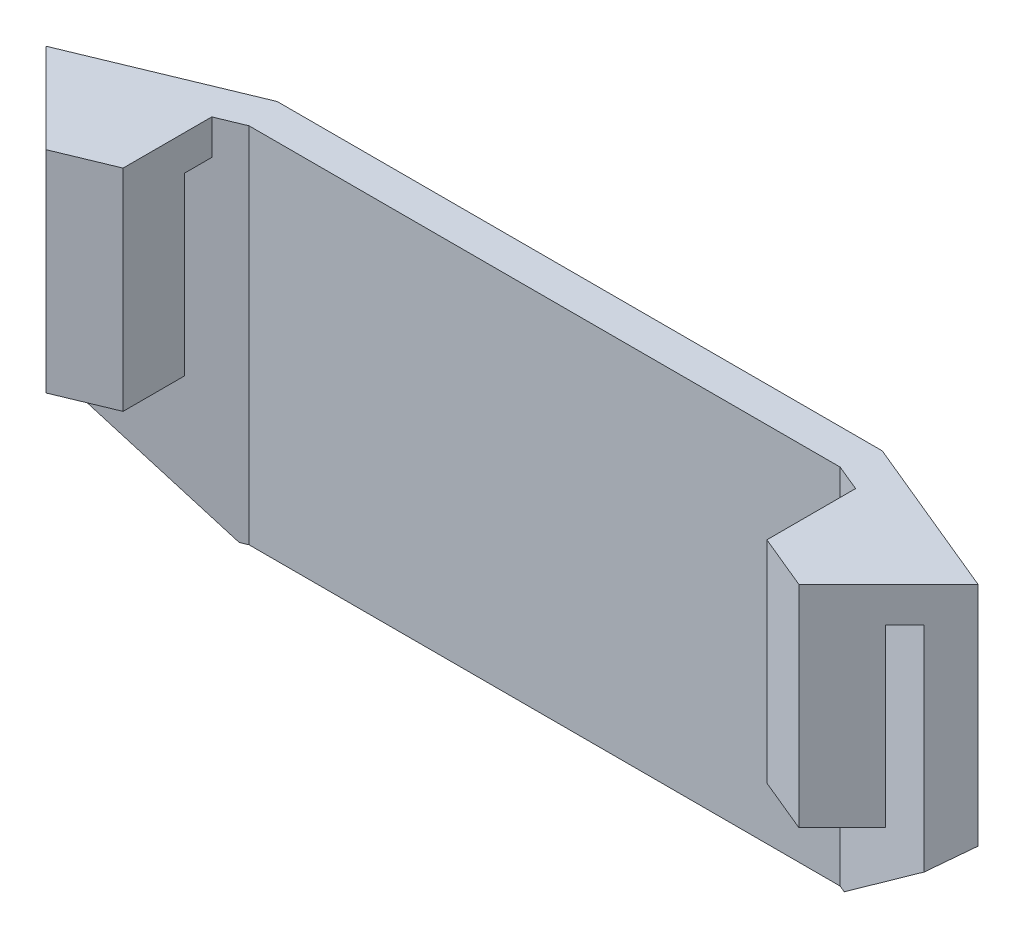
ISO-10303-21;
HEADER;
FILE_DESCRIPTION(('STEP AP214'),'2;1');
FILE_NAME('part.step','',(''),(''),'','','');
FILE_SCHEMA(('AUTOMOTIVE_DESIGN { 1 0 10303 214 1 1 1 1 }'));
ENDSEC;
DATA;
#1=APPLICATION_CONTEXT('core data for automotive mechanical design processes');
#2=APPLICATION_PROTOCOL_DEFINITION('international standard','automotive_design',2000,#1);
#3=PRODUCT_CONTEXT('',#1,'mechanical');
#4=PRODUCT('Part','Part','',(#3));
#5=PRODUCT_RELATED_PRODUCT_CATEGORY('part','',(#4));
#6=PRODUCT_DEFINITION_FORMATION('','',#4);
#7=PRODUCT_DEFINITION_CONTEXT('part definition',#1,'design');
#8=PRODUCT_DEFINITION('design','',#6,#7);
#9=PRODUCT_DEFINITION_SHAPE('','',#8);
#10=(LENGTH_UNIT() NAMED_UNIT(*) SI_UNIT(.MILLI.,.METRE.));
#11=(NAMED_UNIT(*) PLANE_ANGLE_UNIT() SI_UNIT($,.RADIAN.));
#12=(NAMED_UNIT(*) SI_UNIT($,.STERADIAN.) SOLID_ANGLE_UNIT());
#13=UNCERTAINTY_MEASURE_WITH_UNIT(LENGTH_MEASURE(1.E-05),#10,'distance_accuracy_value','');
#14=(GEOMETRIC_REPRESENTATION_CONTEXT(3) GLOBAL_UNCERTAINTY_ASSIGNED_CONTEXT((#13)) GLOBAL_UNIT_ASSIGNED_CONTEXT((#10,
#11,#12)) REPRESENTATION_CONTEXT('',''));
#15=CARTESIAN_POINT('',(0.,0.,0.));
#16=DIRECTION('',(0.,0.,1.));
#17=DIRECTION('',(1.,0.,0.));
#18=AXIS2_PLACEMENT_3D('',#15,#16,#17);
#19=CARTESIAN_POINT('',(0.,0.,0.));
#20=DIRECTION('',(0.,-1.,0.));
#21=DIRECTION('',(0.,0.,-1.));
#22=AXIS2_PLACEMENT_3D('',#19,#20,#21);
#23=PLANE('',#22);
#24=DIRECTION('',(0.707106781186538,0.,-0.707106781186557));
#25=VECTOR('',#24,1.);
#26=CARTESIAN_POINT('',(21.2965728752552,0.,21.2965728752546));
#27=LINE('',#26,#25);
#28=CARTESIAN_POINT('',(35.8679172081224,0.,6.72522854238762));
#29=VERTEX_POINT('',#28);
#30=CARTESIAN_POINT('',(37.5134559672924,0.,5.07968978321691));
#31=VERTEX_POINT('',#30);
#32=EDGE_CURVE('E200',#29,#31,#27,.T.);
#33=ORIENTED_EDGE('',*,*,#32,.F.);
#34=DIRECTION('',(0.923879532511287,0.,0.38268343236509));
#35=VECTOR('',#34,1.);
#36=CARTESIAN_POINT('',(27.4999999999994,0.,3.25912374596785));
#37=LINE('',#36,#35);
#38=CARTESIAN_POINT('',(27.4999999999994,0.,3.25912374596785));
#39=VERTEX_POINT('',#38);
#40=EDGE_CURVE('E184',#39,#29,#37,.T.);
#41=ORIENTED_EDGE('',*,*,#40,.F.);
#42=DIRECTION('',(0.,0.,1.));
#43=VECTOR('',#42,1.);
#44=CARTESIAN_POINT('',(27.5000000000006,0.,0.));
#45=LINE('',#44,#43);
#46=CARTESIAN_POINT('',(27.5000000000006,0.,0.931980515339538));
#47=VERTEX_POINT('',#46);
#48=EDGE_CURVE('E341',#47,#39,#45,.T.);
#49=ORIENTED_EDGE('',*,*,#48,.F.);
#50=DIRECTION('',(-0.923879532511312,0.,-0.382683432365028));
#51=VECTOR('',#50,1.);
#52=CARTESIAN_POINT('',(25.25,0.,0.));
#53=LINE('',#52,#51);
#54=EDGE_CURVE('E209',#31,#47,#53,.T.);
#55=ORIENTED_EDGE('',*,*,#54,.F.);
#56=EDGE_LOOP('',(#33,#41,#49,#55));
#57=FACE_BOUND('',#56,.T.);
#58=ADVANCED_FACE('F49',(#57),#23,.T.);
#59=DIRECTION('',(0.,0.,-1.));
#60=VECTOR('',#59,1.);
#61=CARTESIAN_POINT('',(-27.4999999999994,0.,0.));
#62=LINE('',#61,#60);
#63=CARTESIAN_POINT('',(-27.4999999999994,0.,3.25912374596785));
#64=VERTEX_POINT('',#63);
#65=CARTESIAN_POINT('',(-27.4999999999994,0.,0.9319805153392));
#66=VERTEX_POINT('',#65);
#67=EDGE_CURVE('E328',#64,#66,#62,.T.);
#68=ORIENTED_EDGE('',*,*,#67,.F.);
#69=DIRECTION('',(0.923879532511287,0.,-0.38268343236509));
#70=VECTOR('',#69,1.);
#71=CARTESIAN_POINT('',(-27.4999999999994,0.,3.25912374596785));
#72=LINE('',#71,#70);
#73=CARTESIAN_POINT('',(-35.8679172081224,0.,6.72522854238762));
#74=VERTEX_POINT('',#73);
#75=EDGE_CURVE('E194',#74,#64,#72,.T.);
#76=ORIENTED_EDGE('',*,*,#75,.F.);
#77=DIRECTION('',(0.707106781186536,0.,0.707106781186559));
#78=VECTOR('',#77,1.);
#79=CARTESIAN_POINT('',(-21.2965728752556,0.,21.2965728752549));
#80=LINE('',#79,#78);
#81=CARTESIAN_POINT('',(-37.5134559672923,0.,5.07968978321773));
#82=VERTEX_POINT('',#81);
#83=EDGE_CURVE('E217',#82,#74,#80,.T.);
#84=ORIENTED_EDGE('',*,*,#83,.F.);
#85=DIRECTION('',(-0.92387953251129,0.,0.382683432365082));
#86=VECTOR('',#85,1.);
#87=CARTESIAN_POINT('',(-41.5134559672924,0.,6.73654403270998));
#88=LINE('',#87,#86);
#89=EDGE_CURVE('E257',#66,#82,#88,.T.);
#90=ORIENTED_EDGE('',*,*,#89,.F.);
#91=EDGE_LOOP('',(#68,#76,#84,#90));
#92=FACE_BOUND('',#91,.T.);
#93=ADVANCED_FACE('F435',(#92),#23,.T.);
#94=CARTESIAN_POINT('',(-27.25,3.,8.40517252679576));
#95=DIRECTION('',(-0.382683432365091,0.,-0.923879532511287));
#96=DIRECTION('',(-0.923879532511287,0.,0.382683432365091));
#97=AXIS2_PLACEMENT_3D('',#94,#95,#96);
#98=PLANE('',#97);
#99=DIRECTION('',(0.,1.,0.));
#100=VECTOR('',#99,1.);
#101=CARTESIAN_POINT('',(-32.1558879141792,-41.2003756189153,10.437257836331));
#102=LINE('',#101,#100);
#103=CARTESIAN_POINT('',(-32.1558879141792,-15.,10.437257836331));
#104=VERTEX_POINT('',#103);
#105=CARTESIAN_POINT('',(-32.1558879141792,3.,10.437257836331));
#106=VERTEX_POINT('',#105);
#107=EDGE_CURVE('E331',#104,#106,#102,.T.);
#108=ORIENTED_EDGE('',*,*,#107,.F.);
#109=DIRECTION('',(-0.923879532511287,0.,0.38268343236509));
#110=VECTOR('',#109,1.);
#111=CARTESIAN_POINT('',(-32.1558879141792,-15.,10.437257836331));
#112=LINE('',#111,#110);
#113=CARTESIAN_POINT('',(-27.4999999999994,-15.,8.50872591738877));
#114=VERTEX_POINT('',#113);
#115=EDGE_CURVE('E368',#114,#104,#112,.T.);
#116=ORIENTED_EDGE('',*,*,#115,.F.);
#117=DIRECTION('',(0.,1.,0.));
#118=VECTOR('',#117,1.);
#119=CARTESIAN_POINT('',(-27.4999999999994,-83.6542758172024,8.50872591738877));
#120=LINE('',#119,#118);
#121=CARTESIAN_POINT('',(-27.4999999999994,3.,8.50872591738877));
#122=VERTEX_POINT('',#121);
#123=EDGE_CURVE('E348',#114,#122,#120,.T.);
#124=ORIENTED_EDGE('',*,*,#123,.T.);
#125=DIRECTION('',(0.923879532511286,0.,-0.382683432365091));
#126=VECTOR('',#125,1.);
#127=CARTESIAN_POINT('',(-27.25,3.,8.40517252679576));
#128=LINE('',#127,#126);
#129=EDGE_CURVE('E254',#106,#122,#128,.T.);
#130=ORIENTED_EDGE('',*,*,#129,.F.);
#131=EDGE_LOOP('',(#108,#116,#124,#130));
#132=FACE_BOUND('',#131,.T.);
#133=ADVANCED_FACE('F51',(#132),#98,.F.);
#134=CARTESIAN_POINT('',(-27.25,3.,0.828427124746181));
#135=DIRECTION('',(-0.382683432365091,0.,-0.923879532511287));
#136=DIRECTION('',(-0.923879532511287,0.,0.382683432365091));
#137=AXIS2_PLACEMENT_3D('',#134,#135,#136);
#138=PLANE('',#137);
#139=DIRECTION('',(0.,1.,0.));
#140=VECTOR('',#139,1.);
#141=CARTESIAN_POINT('',(-27.4999999999994,-83.6542758172024,0.9319805153392));
#142=LINE('',#141,#140);
#143=CARTESIAN_POINT('',(-27.4999999999994,3.,0.9319805153392));
#144=VERTEX_POINT('',#143);
#145=EDGE_CURVE('E344',#66,#144,#142,.T.);
#146=ORIENTED_EDGE('',*,*,#145,.F.);
#147=ORIENTED_EDGE('',*,*,#89,.T.);
#148=DIRECTION('',(0.,-1.,0.));
#149=VECTOR('',#148,1.);
#150=CARTESIAN_POINT('',(-37.5134559672923,3.,5.07968978321773));
#151=LINE('',#150,#149);
#152=CARTESIAN_POINT('',(-37.5134559672923,-18.2862737789529,5.07968978321773));
#153=VERTEX_POINT('',#152);
#154=EDGE_CURVE('E211',#82,#153,#151,.T.);
#155=ORIENTED_EDGE('',*,*,#154,.T.);
#156=DIRECTION('',(0.732291697913755,-0.609707077859028,-0.303325152889099));
#157=VECTOR('',#156,1.);
#158=CARTESIAN_POINT('',(-40.5693336018988,-15.7419458448813,6.34547574442438));
#159=LINE('',#158,#157);
#160=CARTESIAN_POINT('',(-25.8467371021316,-28.,0.247176600874102));
#161=VERTEX_POINT('',#160);
#162=EDGE_CURVE('E236',#153,#161,#159,.T.);
#163=ORIENTED_EDGE('',*,*,#162,.T.);
#164=DIRECTION('',(-0.92387953251129,0.,0.382683432365082));
#165=VECTOR('',#164,1.);
#166=CARTESIAN_POINT('',(-41.5134559672924,-28.,6.73654403270998));
#167=LINE('',#166,#165);
#168=CARTESIAN_POINT('',(-25.25,-28.,0.));
#169=VERTEX_POINT('',#168);
#170=EDGE_CURVE('E250',#169,#161,#167,.T.);
#171=ORIENTED_EDGE('',*,*,#170,.F.);
#172=DIRECTION('',(0.,-1.,0.));
#173=VECTOR('',#172,1.);
#174=CARTESIAN_POINT('',(-25.25,3.,0.));
#175=LINE('',#174,#173);
#176=CARTESIAN_POINT('',(-25.25,3.,0.));
#177=VERTEX_POINT('',#176);
#178=EDGE_CURVE('E261',#177,#169,#175,.T.);
#179=ORIENTED_EDGE('',*,*,#178,.F.);
#180=DIRECTION('',(0.923879532511286,0.,-0.382683432365091));
#181=VECTOR('',#180,1.);
#182=CARTESIAN_POINT('',(-27.25,3.,0.828427124746181));
#183=LINE('',#182,#181);
#184=EDGE_CURVE('E265',#144,#177,#183,.T.);
#185=ORIENTED_EDGE('',*,*,#184,.F.);
#186=EDGE_LOOP('',(#146,#147,#155,#163,#171,#179,#185));
#187=FACE_BOUND('',#186,.T.);
#188=ADVANCED_FACE('F592',(#187),#138,.F.);
#189=CARTESIAN_POINT('',(-25.25,3.,0.));
#190=DIRECTION('',(0.,0.,-1.));
#191=DIRECTION('',(-1.,0.,0.));
#192=AXIS2_PLACEMENT_3D('',#189,#190,#191);
#193=PLANE('',#192);
#194=ORIENTED_EDGE('',*,*,#178,.T.);
#195=DIRECTION('',(-1.,0.,0.));
#196=VECTOR('',#195,1.);
#197=CARTESIAN_POINT('',(-25.25,-28.,0.));
#198=LINE('',#197,#196);
#199=CARTESIAN_POINT('',(25.25,-28.,0.));
#200=VERTEX_POINT('',#199);
#201=EDGE_CURVE('E246',#200,#169,#198,.T.);
#202=ORIENTED_EDGE('',*,*,#201,.F.);
#203=DIRECTION('',(0.,-1.,0.));
#204=VECTOR('',#203,1.);
#205=CARTESIAN_POINT('',(25.25,3.,0.));
#206=LINE('',#205,#204);
#207=CARTESIAN_POINT('',(25.25,3.,0.));
#208=VERTEX_POINT('',#207);
#209=EDGE_CURVE('E295',#208,#200,#206,.T.);
#210=ORIENTED_EDGE('',*,*,#209,.F.);
#211=DIRECTION('',(1.,0.,0.));
#212=VECTOR('',#211,1.);
#213=CARTESIAN_POINT('',(-25.25,3.,0.));
#214=LINE('',#213,#212);
#215=EDGE_CURVE('E268',#177,#208,#214,.T.);
#216=ORIENTED_EDGE('',*,*,#215,.F.);
#217=EDGE_LOOP('',(#194,#202,#210,#216));
#218=FACE_BOUND('',#217,.T.);
#219=ADVANCED_FACE('F432',(#218),#193,.F.);
#220=CARTESIAN_POINT('',(25.25,3.,0.));
#221=DIRECTION('',(0.382683432365035,0.,-0.923879532511309));
#222=DIRECTION('',(-0.923879532511309,0.,-0.382683432365035));
#223=AXIS2_PLACEMENT_3D('',#220,#221,#222);
#224=PLANE('',#223);
#225=ORIENTED_EDGE('',*,*,#54,.T.);
#226=DIRECTION('',(0.,1.,0.));
#227=VECTOR('',#226,1.);
#228=CARTESIAN_POINT('',(27.5000000000006,-83.6542758172024,0.9319805153392));
#229=LINE('',#228,#227);
#230=CARTESIAN_POINT('',(27.5000000000006,3.,0.9319805153392));
#231=VERTEX_POINT('',#230);
#232=EDGE_CURVE('E73',#47,#231,#229,.T.);
#233=ORIENTED_EDGE('',*,*,#232,.T.);
#234=DIRECTION('',(0.923879532511309,0.,0.382683432365035));
#235=VECTOR('',#234,1.);
#236=CARTESIAN_POINT('',(25.25,3.,0.));
#237=LINE('',#236,#235);
#238=EDGE_CURVE('E271',#208,#231,#237,.T.);
#239=ORIENTED_EDGE('',*,*,#238,.F.);
#240=ORIENTED_EDGE('',*,*,#209,.T.);
#241=DIRECTION('',(-0.923879532511312,0.,-0.382683432365028));
#242=VECTOR('',#241,1.);
#243=CARTESIAN_POINT('',(25.25,-28.,0.));
#244=LINE('',#243,#242);
#245=CARTESIAN_POINT('',(25.8467371021463,-28.,0.247176600880177));
#246=VERTEX_POINT('',#245);
#247=EDGE_CURVE('E243',#246,#200,#244,.T.);
#248=ORIENTED_EDGE('',*,*,#247,.F.);
#249=DIRECTION('',(0.732291697913564,0.609707077859322,0.303325152888969));
#250=VECTOR('',#249,1.);
#251=CARTESIAN_POINT('',(39.3128190434904,-16.788121599543,5.82501037301138));
#252=LINE('',#251,#250);
#253=CARTESIAN_POINT('',(37.5134559672924,-18.2862737789579,5.07968978321691));
#254=VERTEX_POINT('',#253);
#255=EDGE_CURVE('E230',#246,#254,#252,.T.);
#256=ORIENTED_EDGE('',*,*,#255,.T.);
#257=DIRECTION('',(0.,1.,0.));
#258=VECTOR('',#257,1.);
#259=CARTESIAN_POINT('',(37.5134559672924,3.,5.07968978321691));
#260=LINE('',#259,#258);
#261=EDGE_CURVE('E212',#254,#31,#260,.T.);
#262=ORIENTED_EDGE('',*,*,#261,.T.);
#263=EDGE_LOOP('',(#225,#233,#239,#240,#248,#256,#262));
#264=FACE_BOUND('',#263,.T.);
#265=ADVANCED_FACE('F405',(#264),#224,.F.);
#266=CARTESIAN_POINT('',(27.25,3.,8.40517252679527));
#267=DIRECTION('',(0.382683432365035,0.,-0.923879532511309));
#268=DIRECTION('',(-0.923879532511309,0.,-0.382683432365035));
#269=AXIS2_PLACEMENT_3D('',#266,#267,#268);
#270=PLANE('',#269);
#271=DIRECTION('',(0.923879532511309,0.,0.382683432365035));
#272=VECTOR('',#271,1.);
#273=CARTESIAN_POINT('',(27.25,3.,8.40517252679527));
#274=LINE('',#273,#272);
#275=CARTESIAN_POINT('',(27.5000000000006,3.,8.50872591738877));
#276=VERTEX_POINT('',#275);
#277=CARTESIAN_POINT('',(32.1558879141792,3.,10.4372578363302));
#278=VERTEX_POINT('',#277);
#279=EDGE_CURVE('E274',#276,#278,#274,.T.);
#280=ORIENTED_EDGE('',*,*,#279,.F.);
#281=DIRECTION('',(0.,1.,0.));
#282=VECTOR('',#281,1.);
#283=CARTESIAN_POINT('',(27.5000000000006,-83.6542758172024,8.50872591738877));
#284=LINE('',#283,#282);
#285=CARTESIAN_POINT('',(27.4999999999994,-15.,8.50872591738877));
#286=VERTEX_POINT('',#285);
#287=EDGE_CURVE('E353',#286,#276,#284,.T.);
#288=ORIENTED_EDGE('',*,*,#287,.F.);
#289=DIRECTION('',(-0.923879532511287,0.,-0.38268343236509));
#290=VECTOR('',#289,1.);
#291=CARTESIAN_POINT('',(32.1558879141792,-15.,10.437257836331));
#292=LINE('',#291,#290);
#293=CARTESIAN_POINT('',(32.1558879141792,-15.,10.437257836331));
#294=VERTEX_POINT('',#293);
#295=EDGE_CURVE('E205',#294,#286,#292,.T.);
#296=ORIENTED_EDGE('',*,*,#295,.F.);
#297=DIRECTION('',(0.,1.,0.));
#298=VECTOR('',#297,1.);
#299=CARTESIAN_POINT('',(32.1558879141792,-41.2003756189153,10.4372578363302));
#300=LINE('',#299,#298);
#301=EDGE_CURVE('E322',#294,#278,#300,.T.);
#302=ORIENTED_EDGE('',*,*,#301,.T.);
#303=EDGE_LOOP('',(#280,#288,#296,#302));
#304=FACE_BOUND('',#303,.T.);
#305=ADVANCED_FACE('F424',(#304),#270,.F.);
#306=CARTESIAN_POINT('',(41.5134559672927,3.,3.48936743182891));
#307=DIRECTION('',(-0.382683432365036,0.,0.923879532511309));
#308=DIRECTION('',(0.923879532511309,0.,0.382683432365036));
#309=AXIS2_PLACEMENT_3D('',#306,#307,#308);
#310=PLANE('',#309);
#311=DIRECTION('',(-0.923879532511309,0.,-0.382683432365036));
#312=VECTOR('',#311,1.);
#313=CARTESIAN_POINT('',(41.5134559672927,3.,3.48936743182891));
#314=LINE('',#313,#312);
#315=CARTESIAN_POINT('',(39.8095565614851,3.,2.78358918902409));
#316=VERTEX_POINT('',#315);
#317=CARTESIAN_POINT('',(25.8467371021464,3.,-3.00000000000005));
#318=VERTEX_POINT('',#317);
#319=EDGE_CURVE('E277',#316,#318,#314,.T.);
#320=ORIENTED_EDGE('',*,*,#319,.F.);
#321=DIRECTION('',(0.,1.,0.));
#322=VECTOR('',#321,1.);
#323=CARTESIAN_POINT('',(39.8095565614851,-41.2003756189153,2.78358918902409));
#324=LINE('',#323,#322);
#325=CARTESIAN_POINT('',(39.8095565614851,-16.3745372568247,2.78358918902409));
#326=VERTEX_POINT('',#325);
#327=EDGE_CURVE('E314',#326,#316,#324,.T.);
#328=ORIENTED_EDGE('',*,*,#327,.F.);
#329=DIRECTION('',(0.732291697913564,0.609707077859322,0.30332515288897));
#330=VECTOR('',#329,1.);
#331=CARTESIAN_POINT('',(42.6615062643888,-14.,3.96490543517252));
#332=LINE('',#331,#330);
#333=CARTESIAN_POINT('',(25.8467371021463,-28.,-3.00000000000006));
#334=VERTEX_POINT('',#333);
#335=EDGE_CURVE('E226',#334,#326,#332,.T.);
#336=ORIENTED_EDGE('',*,*,#335,.F.);
#337=DIRECTION('',(0.,-1.,0.));
#338=VECTOR('',#337,1.);
#339=CARTESIAN_POINT('',(25.8467371021464,3.,-3.00000000000005));
#340=LINE('',#339,#338);
#341=EDGE_CURVE('E291',#318,#334,#340,.T.);
#342=ORIENTED_EDGE('',*,*,#341,.F.);
#343=EDGE_LOOP('',(#320,#328,#336,#342));
#344=FACE_BOUND('',#343,.T.);
#345=ADVANCED_FACE('F318',(#344),#310,.F.);
#346=CARTESIAN_POINT('',(25.8467371021464,3.,-3.00000000000005));
#347=DIRECTION('',(0.,0.,1.));
#348=DIRECTION('',(1.,0.,0.));
#349=AXIS2_PLACEMENT_3D('',#346,#347,#348);
#350=PLANE('',#349);
#351=ORIENTED_EDGE('',*,*,#341,.T.);
#352=DIRECTION('',(1.,0.,0.));
#353=VECTOR('',#352,1.);
#354=CARTESIAN_POINT('',(25.8467371021464,-28.,-3.00000000000005));
#355=LINE('',#354,#353);
#356=CARTESIAN_POINT('',(-25.8467371021316,-28.,-3.00000000000004));
#357=VERTEX_POINT('',#356);
#358=EDGE_CURVE('E239',#357,#334,#355,.T.);
#359=ORIENTED_EDGE('',*,*,#358,.F.);
#360=DIRECTION('',(0.,-1.,0.));
#361=VECTOR('',#360,1.);
#362=CARTESIAN_POINT('',(-25.8467371021316,3.,-3.00000000000004));
#363=LINE('',#362,#361);
#364=CARTESIAN_POINT('',(-25.8467371021316,3.,-3.00000000000004));
#365=VERTEX_POINT('',#364);
#366=EDGE_CURVE('E287',#365,#357,#363,.T.);
#367=ORIENTED_EDGE('',*,*,#366,.F.);
#368=DIRECTION('',(-1.,0.,0.));
#369=VECTOR('',#368,1.);
#370=CARTESIAN_POINT('',(25.8467371021464,3.,-3.00000000000005));
#371=LINE('',#370,#369);
#372=EDGE_CURVE('E280',#318,#365,#371,.T.);
#373=ORIENTED_EDGE('',*,*,#372,.F.);
#374=EDGE_LOOP('',(#351,#359,#367,#373));
#375=FACE_BOUND('',#374,.T.);
#376=ADVANCED_FACE('F417',(#375),#350,.F.);
#377=CARTESIAN_POINT('',(-41.5134559672923,3.,3.48936743183595));
#378=DIRECTION('',(0.38268343236509,0.,0.923879532511287));
#379=DIRECTION('',(0.923879532511287,0.,-0.38268343236509));
#380=AXIS2_PLACEMENT_3D('',#377,#378,#379);
#381=PLANE('',#380);
#382=DIRECTION('',(0.732291697913755,-0.609707077859028,-0.303325152889099));
#383=VECTOR('',#382,1.);
#384=CARTESIAN_POINT('',(-42.6615062643865,-14.,3.96490543517883));
#385=LINE('',#384,#383);
#386=CARTESIAN_POINT('',(-39.8095565614807,-16.3745372568247,2.7835891890293));
#387=VERTEX_POINT('',#386);
#388=EDGE_CURVE('E233',#387,#357,#385,.T.);
#389=ORIENTED_EDGE('',*,*,#388,.F.);
#390=DIRECTION('',(0.,1.,0.));
#391=VECTOR('',#390,1.);
#392=CARTESIAN_POINT('',(-39.8095565614807,-41.2003756189153,2.78358918902931));
#393=LINE('',#392,#391);
#394=CARTESIAN_POINT('',(-39.8095565614807,3.,2.78358918902931));
#395=VERTEX_POINT('',#394);
#396=EDGE_CURVE('E219',#387,#395,#393,.T.);
#397=ORIENTED_EDGE('',*,*,#396,.T.);
#398=DIRECTION('',(-0.923879532511287,0.,0.38268343236509));
#399=VECTOR('',#398,1.);
#400=CARTESIAN_POINT('',(-41.5134559672923,3.,3.48936743183595));
#401=LINE('',#400,#399);
#402=EDGE_CURVE('E283',#365,#395,#401,.T.);
#403=ORIENTED_EDGE('',*,*,#402,.F.);
#404=ORIENTED_EDGE('',*,*,#366,.T.);
#405=EDGE_LOOP('',(#389,#397,#403,#404));
#406=FACE_BOUND('',#405,.T.);
#407=ADVANCED_FACE('F444',(#406),#381,.F.);
#408=CARTESIAN_POINT('',(0.,3.,0.));
#409=DIRECTION('',(0.,-1.,0.));
#410=DIRECTION('',(0.,0.,-1.));
#411=AXIS2_PLACEMENT_3D('',#408,#409,#410);
#412=PLANE('',#411);
#413=ORIENTED_EDGE('',*,*,#238,.T.);
#414=DIRECTION('',(0.,0.,-1.));
#415=VECTOR('',#414,1.);
#416=CARTESIAN_POINT('',(27.5000000000006,3.,8.50872591738877));
#417=LINE('',#416,#415);
#418=EDGE_CURVE('E349',#276,#231,#417,.T.);
#419=ORIENTED_EDGE('',*,*,#418,.F.);
#420=ORIENTED_EDGE('',*,*,#279,.T.);
#421=DIRECTION('',(-0.707106781186538,0.,0.707106781186557));
#422=VECTOR('',#421,1.);
#423=CARTESIAN_POINT('',(39.8095565614851,3.,2.78358918902409));
#424=LINE('',#423,#422);
#425=EDGE_CURVE('E321',#316,#278,#424,.T.);
#426=ORIENTED_EDGE('',*,*,#425,.F.);
#427=ORIENTED_EDGE('',*,*,#319,.T.);
#428=ORIENTED_EDGE('',*,*,#372,.T.);
#429=ORIENTED_EDGE('',*,*,#402,.T.);
#430=DIRECTION('',(-0.707106781186536,0.,-0.707106781186559));
#431=VECTOR('',#430,1.);
#432=CARTESIAN_POINT('',(-39.8095565614807,3.,2.78358918902931));
#433=LINE('',#432,#431);
#434=EDGE_CURVE('E326',#106,#395,#433,.T.);
#435=ORIENTED_EDGE('',*,*,#434,.F.);
#436=ORIENTED_EDGE('',*,*,#129,.T.);
#437=DIRECTION('',(0.,0.,1.));
#438=VECTOR('',#437,1.);
#439=CARTESIAN_POINT('',(-27.4999999999994,3.,0.9319805153392));
#440=LINE('',#439,#438);
#441=EDGE_CURVE('E360',#144,#122,#440,.T.);
#442=ORIENTED_EDGE('',*,*,#441,.F.);
#443=ORIENTED_EDGE('',*,*,#184,.T.);
#444=ORIENTED_EDGE('',*,*,#215,.T.);
#445=EDGE_LOOP('',(#413,#419,#420,#426,#427,#428,#429,#435,#436,#442,#443,#444));
#446=FACE_BOUND('',#445,.T.);
#447=ADVANCED_FACE('F421',(#446),#412,.F.);
#448=CARTESIAN_POINT('',(0.,-28.,0.));
#449=DIRECTION('',(0.,1.,0.));
#450=DIRECTION('',(0.,0.,1.));
#451=AXIS2_PLACEMENT_3D('',#448,#449,#450);
#452=PLANE('',#451);
#453=ORIENTED_EDGE('',*,*,#358,.T.);
#454=DIRECTION('',(0.,0.,1.));
#455=VECTOR('',#454,1.);
#456=CARTESIAN_POINT('',(25.8467371021463,-28.,0.));
#457=LINE('',#456,#455);
#458=EDGE_CURVE('E304',#334,#246,#457,.T.);
#459=ORIENTED_EDGE('',*,*,#458,.T.);
#460=ORIENTED_EDGE('',*,*,#247,.T.);
#461=ORIENTED_EDGE('',*,*,#201,.T.);
#462=ORIENTED_EDGE('',*,*,#170,.T.);
#463=DIRECTION('',(0.,0.,-1.));
#464=VECTOR('',#463,1.);
#465=CARTESIAN_POINT('',(-25.8467371021316,-28.,0.));
#466=LINE('',#465,#464);
#467=EDGE_CURVE('E260',#161,#357,#466,.T.);
#468=ORIENTED_EDGE('',*,*,#467,.T.);
#469=EDGE_LOOP('',(#453,#459,#460,#461,#462,#468));
#470=FACE_BOUND('',#469,.T.);
#471=ADVANCED_FACE('F411',(#470),#452,.F.);
#472=CARTESIAN_POINT('',(-42.6615062643865,-14.,33.9649054351788));
#473=DIRECTION('',(0.63985236974686,0.768497849658233,0.));
#474=DIRECTION('',(-0.768497849658233,0.63985236974686,0.));
#475=AXIS2_PLACEMENT_3D('',#472,#473,#474);
#476=PLANE('',#475);
#477=ORIENTED_EDGE('',*,*,#162,.F.);
#478=DIRECTION('',(-0.609345596225363,0.507341983992544,-0.609345596225382));
#479=VECTOR('',#478,1.);
#480=CARTESIAN_POINT('',(-30.0248846573848,-24.5212685818578,12.5682610931255));
#481=LINE('',#480,#479);
#482=EDGE_CURVE('E11',#153,#387,#481,.T.);
#483=ORIENTED_EDGE('',*,*,#482,.T.);
#484=ORIENTED_EDGE('',*,*,#388,.T.);
#485=ORIENTED_EDGE('',*,*,#467,.F.);
#486=EDGE_LOOP('',(#477,#483,#484,#485));
#487=FACE_BOUND('',#486,.T.);
#488=ADVANCED_FACE('F468',(#487),#476,.F.);
#489=CARTESIAN_POINT('',(42.6615062643888,-14.,33.9649054351725));
#490=DIRECTION('',(-0.63985236974714,0.768497849657999,0.));
#491=DIRECTION('',(-0.768497849657999,-0.63985236974714,0.));
#492=AXIS2_PLACEMENT_3D('',#489,#490,#491);
#493=PLANE('',#492);
#494=ORIENTED_EDGE('',*,*,#335,.T.);
#495=DIRECTION('',(-0.609345596225247,-0.507341983992824,0.609345596225264));
#496=VECTOR('',#495,1.);
#497=CARTESIAN_POINT('',(30.0248846573931,-24.5212685818606,12.5682610931164));
#498=LINE('',#497,#496);
#499=EDGE_CURVE('E58',#326,#254,#498,.T.);
#500=ORIENTED_EDGE('',*,*,#499,.T.);
#501=ORIENTED_EDGE('',*,*,#255,.F.);
#502=ORIENTED_EDGE('',*,*,#458,.F.);
#503=EDGE_LOOP('',(#494,#500,#501,#502));
#504=FACE_BOUND('',#503,.T.);
#505=ADVANCED_FACE('F310',(#504),#493,.F.);
#506=CARTESIAN_POINT('',(39.8095565614851,-41.2003756189153,2.78358918902409));
#507=DIRECTION('',(-0.707106781186557,0.,-0.707106781186538));
#508=DIRECTION('',(-0.707106781186538,0.,0.707106781186557));
#509=AXIS2_PLACEMENT_3D('',#506,#507,#508);
#510=PLANE('',#509);
#511=ORIENTED_EDGE('',*,*,#301,.F.);
#512=DIRECTION('',(-0.707106781186531,0.,0.707106781186564));
#513=VECTOR('',#512,1.);
#514=CARTESIAN_POINT('',(35.8679172081224,-15.,6.72522854238762));
#515=LINE('',#514,#513);
#516=CARTESIAN_POINT('',(35.8679172081224,-15.,6.72522854238762));
#517=VERTEX_POINT('',#516);
#518=EDGE_CURVE('E203',#517,#294,#515,.T.);
#519=ORIENTED_EDGE('',*,*,#518,.F.);
#520=DIRECTION('',(0.,1.,0.));
#521=VECTOR('',#520,1.);
#522=CARTESIAN_POINT('',(35.8679172081224,-15.,6.72522854238762));
#523=LINE('',#522,#521);
#524=EDGE_CURVE('E187',#517,#29,#523,.T.);
#525=ORIENTED_EDGE('',*,*,#524,.T.);
#526=ORIENTED_EDGE('',*,*,#32,.T.);
#527=ORIENTED_EDGE('',*,*,#261,.F.);
#528=ORIENTED_EDGE('',*,*,#499,.F.);
#529=ORIENTED_EDGE('',*,*,#327,.T.);
#530=ORIENTED_EDGE('',*,*,#425,.T.);
#531=EDGE_LOOP('',(#511,#519,#525,#526,#527,#528,#529,#530));
#532=FACE_BOUND('',#531,.T.);
#533=ADVANCED_FACE('F198',(#532),#510,.F.);
#534=CARTESIAN_POINT('',(-39.8095565614807,-41.2003756189153,2.78358918902931));
#535=DIRECTION('',(0.707106781186559,0.,-0.707106781186536));
#536=DIRECTION('',(-0.707106781186536,0.,-0.707106781186559));
#537=AXIS2_PLACEMENT_3D('',#534,#535,#536);
#538=PLANE('',#537);
#539=ORIENTED_EDGE('',*,*,#83,.T.);
#540=DIRECTION('',(0.,1.,0.));
#541=VECTOR('',#540,1.);
#542=CARTESIAN_POINT('',(-35.8679172081224,-15.,6.72522854238762));
#543=LINE('',#542,#541);
#544=CARTESIAN_POINT('',(-35.8679172081224,-15.,6.72522854238762));
#545=VERTEX_POINT('',#544);
#546=EDGE_CURVE('E363',#545,#74,#543,.T.);
#547=ORIENTED_EDGE('',*,*,#546,.F.);
#548=DIRECTION('',(-0.707106781186531,0.,-0.707106781186564));
#549=VECTOR('',#548,1.);
#550=CARTESIAN_POINT('',(-35.8679172081224,-15.,6.72522854238762));
#551=LINE('',#550,#549);
#552=EDGE_CURVE('E371',#104,#545,#551,.T.);
#553=ORIENTED_EDGE('',*,*,#552,.F.);
#554=ORIENTED_EDGE('',*,*,#107,.T.);
#555=ORIENTED_EDGE('',*,*,#434,.T.);
#556=ORIENTED_EDGE('',*,*,#396,.F.);
#557=ORIENTED_EDGE('',*,*,#482,.F.);
#558=ORIENTED_EDGE('',*,*,#154,.F.);
#559=EDGE_LOOP('',(#539,#547,#553,#554,#555,#556,#557,#558));
#560=FACE_BOUND('',#559,.T.);
#561=ADVANCED_FACE('F487',(#560),#538,.F.);
#562=CARTESIAN_POINT('',(27.5000000000006,-83.6542758172024,8.50872591738877));
#563=DIRECTION('',(1.,0.,0.));
#564=DIRECTION('',(0.,0.,-1.));
#565=AXIS2_PLACEMENT_3D('',#562,#563,#564);
#566=PLANE('',#565);
#567=ORIENTED_EDGE('',*,*,#48,.T.);
#568=DIRECTION('',(0.,1.,0.));
#569=VECTOR('',#568,1.);
#570=CARTESIAN_POINT('',(27.4999999999994,-15.,3.25912374596785));
#571=LINE('',#570,#569);
#572=CARTESIAN_POINT('',(27.4999999999994,-15.,3.25912374596785));
#573=VERTEX_POINT('',#572);
#574=EDGE_CURVE('E190',#573,#39,#571,.T.);
#575=ORIENTED_EDGE('',*,*,#574,.F.);
#576=DIRECTION('',(0.,0.,-1.));
#577=VECTOR('',#576,1.);
#578=CARTESIAN_POINT('',(27.4999999999994,-15.,8.50872591738877));
#579=LINE('',#578,#577);
#580=EDGE_CURVE('E195',#286,#573,#579,.T.);
#581=ORIENTED_EDGE('',*,*,#580,.F.);
#582=ORIENTED_EDGE('',*,*,#287,.T.);
#583=ORIENTED_EDGE('',*,*,#418,.T.);
#584=ORIENTED_EDGE('',*,*,#232,.F.);
#585=EDGE_LOOP('',(#567,#575,#581,#582,#583,#584));
#586=FACE_BOUND('',#585,.T.);
#587=ADVANCED_FACE('F402',(#586),#566,.F.);
#588=CARTESIAN_POINT('',(-27.4999999999994,-83.6542758172024,0.9319805153392));
#589=DIRECTION('',(-1.,0.,0.));
#590=DIRECTION('',(0.,0.,1.));
#591=AXIS2_PLACEMENT_3D('',#588,#589,#590);
#592=PLANE('',#591);
#593=ORIENTED_EDGE('',*,*,#123,.F.);
#594=DIRECTION('',(0.,0.,1.));
#595=VECTOR('',#594,1.);
#596=CARTESIAN_POINT('',(-27.4999999999994,-15.,8.50872591738877));
#597=LINE('',#596,#595);
#598=CARTESIAN_POINT('',(-27.4999999999994,-15.,3.25912374596785));
#599=VERTEX_POINT('',#598);
#600=EDGE_CURVE('E375',#599,#114,#597,.T.);
#601=ORIENTED_EDGE('',*,*,#600,.F.);
#602=DIRECTION('',(0.,1.,0.));
#603=VECTOR('',#602,1.);
#604=CARTESIAN_POINT('',(-27.4999999999994,-15.,3.25912374596785));
#605=LINE('',#604,#603);
#606=EDGE_CURVE('E65',#599,#64,#605,.T.);
#607=ORIENTED_EDGE('',*,*,#606,.T.);
#608=ORIENTED_EDGE('',*,*,#67,.T.);
#609=ORIENTED_EDGE('',*,*,#145,.T.);
#610=ORIENTED_EDGE('',*,*,#441,.T.);
#611=EDGE_LOOP('',(#593,#601,#607,#608,#609,#610));
#612=FACE_BOUND('',#611,.T.);
#613=ADVANCED_FACE('F501',(#612),#592,.F.);
#614=CARTESIAN_POINT('',(-27.4999999999994,-15.,3.25912374596785));
#615=DIRECTION('',(0.38268343236509,0.,0.923879532511286));
#616=DIRECTION('',(0.923879532511287,0.,-0.38268343236509));
#617=AXIS2_PLACEMENT_3D('',#614,#615,#616);
#618=PLANE('',#617);
#619=ORIENTED_EDGE('',*,*,#75,.T.);
#620=ORIENTED_EDGE('',*,*,#606,.F.);
#621=DIRECTION('',(0.923879532511287,0.,-0.38268343236509));
#622=VECTOR('',#621,1.);
#623=CARTESIAN_POINT('',(-27.4999999999994,-15.,3.25912374596785));
#624=LINE('',#623,#622);
#625=EDGE_CURVE('E379',#545,#599,#624,.T.);
#626=ORIENTED_EDGE('',*,*,#625,.F.);
#627=ORIENTED_EDGE('',*,*,#546,.T.);
#628=EDGE_LOOP('',(#619,#620,#626,#627));
#629=FACE_BOUND('',#628,.T.);
#630=ADVANCED_FACE('F508',(#629),#618,.F.);
#631=CARTESIAN_POINT('',(0.,-15.,0.));
#632=DIRECTION('',(0.,1.,0.));
#633=DIRECTION('',(0.,0.,1.));
#634=AXIS2_PLACEMENT_3D('',#631,#632,#633);
#635=PLANE('',#634);
#636=ORIENTED_EDGE('',*,*,#552,.T.);
#637=ORIENTED_EDGE('',*,*,#625,.T.);
#638=ORIENTED_EDGE('',*,*,#600,.T.);
#639=ORIENTED_EDGE('',*,*,#115,.T.);
#640=EDGE_LOOP('',(#636,#637,#638,#639));
#641=FACE_BOUND('',#640,.T.);
#642=ADVANCED_FACE('F515',(#641),#635,.F.);
#643=CARTESIAN_POINT('',(27.4999999999994,-15.,3.25912374596785));
#644=DIRECTION('',(-0.38268343236509,0.,0.923879532511286));
#645=DIRECTION('',(0.923879532511287,0.,0.38268343236509));
#646=AXIS2_PLACEMENT_3D('',#643,#644,#645);
#647=PLANE('',#646);
#648=ORIENTED_EDGE('',*,*,#40,.T.);
#649=ORIENTED_EDGE('',*,*,#524,.F.);
#650=DIRECTION('',(0.923879532511287,0.,0.38268343236509));
#651=VECTOR('',#650,1.);
#652=CARTESIAN_POINT('',(27.4999999999994,-15.,3.25912374596785));
#653=LINE('',#652,#651);
#654=EDGE_CURVE('E388',#573,#517,#653,.T.);
#655=ORIENTED_EDGE('',*,*,#654,.F.);
#656=ORIENTED_EDGE('',*,*,#574,.T.);
#657=EDGE_LOOP('',(#648,#649,#655,#656));
#658=FACE_BOUND('',#657,.T.);
#659=ADVANCED_FACE('F186',(#658),#647,.F.);
#660=CARTESIAN_POINT('',(0.,-15.,0.));
#661=DIRECTION('',(0.,-1.,0.));
#662=DIRECTION('',(0.,0.,-1.));
#663=AXIS2_PLACEMENT_3D('',#660,#661,#662);
#664=PLANE('',#663);
#665=ORIENTED_EDGE('',*,*,#580,.T.);
#666=ORIENTED_EDGE('',*,*,#654,.T.);
#667=ORIENTED_EDGE('',*,*,#518,.T.);
#668=ORIENTED_EDGE('',*,*,#295,.T.);
#669=EDGE_LOOP('',(#665,#666,#667,#668));
#670=FACE_BOUND('',#669,.T.);
#671=ADVANCED_FACE('F400',(#670),#664,.T.);
#672=CLOSED_SHELL('',(#58,#93,#133,#188,#219,#265,#305,#345,#376,#407,#447,#471,#488,#505,#533,
#561,#587,#613,#630,#642,#659,#671));
#673=MANIFOLD_SOLID_BREP('B2',#672);
#674=ADVANCED_BREP_SHAPE_REPRESENTATION('',(#18,#673),#14);
#675=SHAPE_DEFINITION_REPRESENTATION(#9,#674);
ENDSEC;
END-ISO-10303-21;
